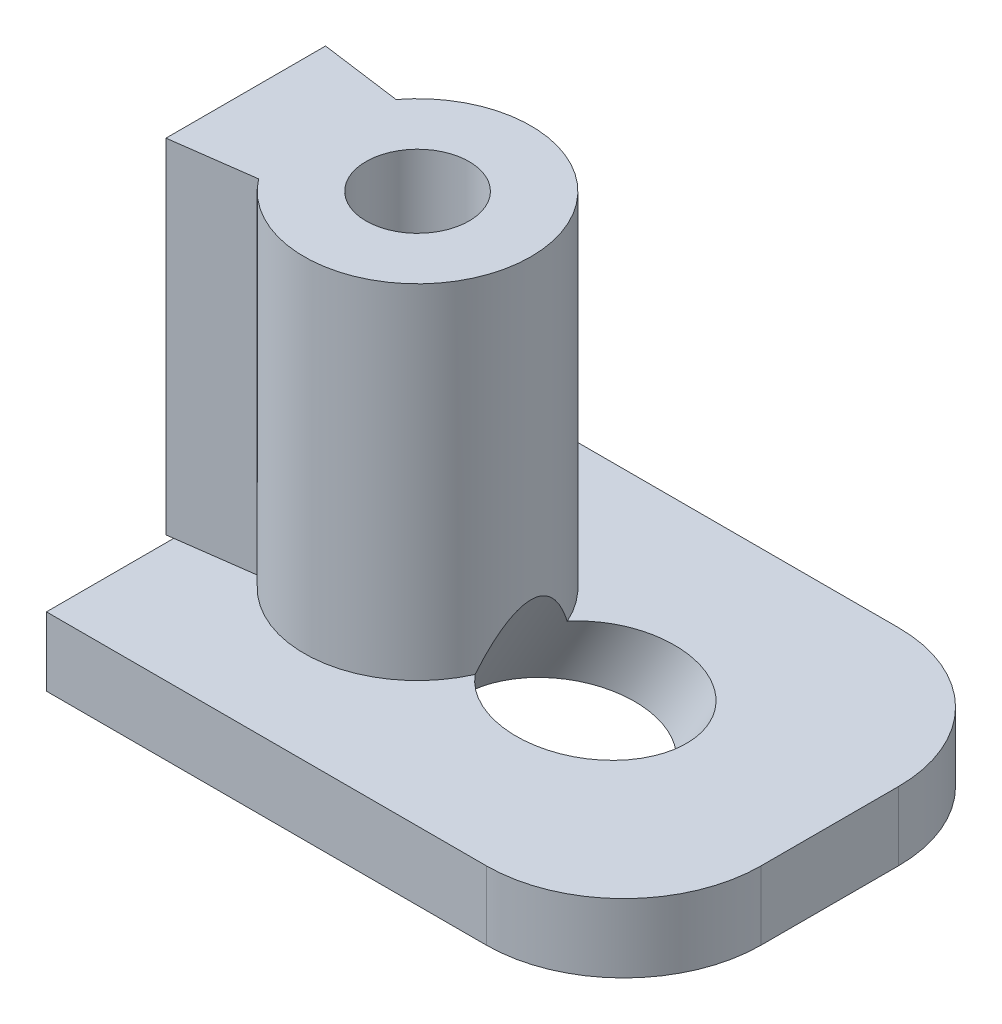
ISO-10303-21;
HEADER;
FILE_DESCRIPTION(('STEP AP214'),'2;1');
FILE_NAME('part.step','',(''),(''),'','','');
FILE_SCHEMA(('AUTOMOTIVE_DESIGN { 1 0 10303 214 1 1 1 1 }'));
ENDSEC;
DATA;
#1=APPLICATION_CONTEXT('core data for automotive mechanical design processes');
#2=APPLICATION_PROTOCOL_DEFINITION('international standard','automotive_design',2000,#1);
#3=PRODUCT_CONTEXT('',#1,'mechanical');
#4=PRODUCT('Part','Part','',(#3));
#5=PRODUCT_RELATED_PRODUCT_CATEGORY('part','',(#4));
#6=PRODUCT_DEFINITION_FORMATION('','',#4);
#7=PRODUCT_DEFINITION_CONTEXT('part definition',#1,'design');
#8=PRODUCT_DEFINITION('design','',#6,#7);
#9=PRODUCT_DEFINITION_SHAPE('','',#8);
#10=(LENGTH_UNIT() NAMED_UNIT(*) SI_UNIT(.MILLI.,.METRE.));
#11=(NAMED_UNIT(*) PLANE_ANGLE_UNIT() SI_UNIT($,.RADIAN.));
#12=(NAMED_UNIT(*) SI_UNIT($,.STERADIAN.) SOLID_ANGLE_UNIT());
#13=UNCERTAINTY_MEASURE_WITH_UNIT(LENGTH_MEASURE(1.E-05),#10,'distance_accuracy_value','');
#14=(GEOMETRIC_REPRESENTATION_CONTEXT(3) GLOBAL_UNCERTAINTY_ASSIGNED_CONTEXT((#13)) GLOBAL_UNIT_ASSIGNED_CONTEXT((#10,
#11,#12)) REPRESENTATION_CONTEXT('',''));
#15=CARTESIAN_POINT('',(0.,0.,0.));
#16=DIRECTION('',(0.,0.,1.));
#17=DIRECTION('',(1.,0.,0.));
#18=AXIS2_PLACEMENT_3D('',#15,#16,#17);
#19=CARTESIAN_POINT('',(2.5,7.75,0.));
#20=DIRECTION('',(0.,1.,0.));
#21=DIRECTION('',(0.,0.,1.));
#22=AXIS2_PLACEMENT_3D('',#19,#20,#21);
#23=PLANE('',#22);
#24=DIRECTION('',(0.,0.,-1.));
#25=VECTOR('',#24,1.);
#26=CARTESIAN_POINT('',(1.30000000001017,7.75,1.49999999996326));
#27=LINE('',#26,#25);
#28=CARTESIAN_POINT('',(1.30000000001017,7.75,0.573731658954848));
#29=VERTEX_POINT('',#28);
#30=CARTESIAN_POINT('',(1.30000000001017,7.75,-0.573731658954847));
#31=VERTEX_POINT('',#30);
#32=EDGE_CURVE('E48',#29,#31,#27,.T.);
#33=ORIENTED_EDGE('',*,*,#32,.F.);
#34=DIRECTION('',(0.990932376959291,0.,-0.134361543210135));
#35=VECTOR('',#34,1.);
#36=CARTESIAN_POINT('',(1.84377976257967,7.75,0.500000000000001));
#37=LINE('',#36,#35);
#38=CARTESIAN_POINT('',(1.25000000001017,7.75,0.580511210533455));
#39=VERTEX_POINT('',#38);
#40=EDGE_CURVE('E281',#39,#29,#37,.T.);
#41=ORIENTED_EDGE('',*,*,#40,.F.);
#42=DIRECTION('',(0.,0.,1.));
#43=VECTOR('',#42,1.);
#44=CARTESIAN_POINT('',(1.25000000001017,7.75,0.580511210533455));
#45=LINE('',#44,#43);
#46=CARTESIAN_POINT('',(1.25000000001017,7.75,-0.580511210533454));
#47=VERTEX_POINT('',#46);
#48=EDGE_CURVE('E136',#47,#39,#45,.T.);
#49=ORIENTED_EDGE('',*,*,#48,.F.);
#50=DIRECTION('',(-0.990932376959291,0.,-0.134361543210137));
#51=VECTOR('',#50,1.);
#52=CARTESIAN_POINT('',(1.25000000001017,7.75,-0.580511210533454));
#53=LINE('',#52,#51);
#54=EDGE_CURVE('E227',#31,#47,#53,.T.);
#55=ORIENTED_EDGE('',*,*,#54,.F.);
#56=EDGE_LOOP('',(#33,#41,#49,#55));
#57=FACE_BOUND('',#56,.T.);
#58=ADVANCED_FACE('F39',(#57),#23,.F.);
#59=CARTESIAN_POINT('',(2.5,9.25,0.));
#60=DIRECTION('',(0.,-1.,0.));
#61=DIRECTION('',(0.,0.,-1.));
#62=AXIS2_PLACEMENT_3D('',#59,#60,#61);
#63=CYLINDRICAL_SURFACE('',#62,0.824999999999999);
#64=CARTESIAN_POINT('',(2.5,7.75,0.));
#65=DIRECTION('',(0.,1.,0.));
#66=DIRECTION('',(0.,0.,1.));
#67=AXIS2_PLACEMENT_3D('',#64,#65,#66);
#68=CIRCLE('',#67,0.824999999999999);
#69=CARTESIAN_POINT('',(1.84377976257967,7.75,0.500000000000001));
#70=VERTEX_POINT('',#69);
#71=CARTESIAN_POINT('',(3.25386128245776,7.75,0.335139026093854));
#72=VERTEX_POINT('',#71);
#73=EDGE_CURVE('E233',#70,#72,#68,.T.);
#74=ORIENTED_EDGE('',*,*,#73,.T.);
#75=CARTESIAN_POINT('',(3.25386128245776,7.75,0.335139026093854));
#76=CARTESIAN_POINT('',(3.25811827945143,7.77111145134007,0.325541480594741));
#77=CARTESIAN_POINT('',(3.26237618985324,7.79203851414726,0.315490895272771));
#78=CARTESIAN_POINT('',(3.27087060163928,7.83346444112072,0.294143706094102));
#79=CARTESIAN_POINT('',(3.27510666885029,7.85395862240085,0.282837894462469));
#80=CARTESIAN_POINT('',(3.28365867745061,7.89504882720899,0.258226700738959));
#81=CARTESIAN_POINT('',(3.28796923505354,7.91560562627378,0.244852971195866));
#82=CARTESIAN_POINT('',(3.29633558540741,7.95525746882288,0.216100636082207));
#83=CARTESIAN_POINT('',(3.30039223893617,7.97435750521167,0.200729416591836));
#84=CARTESIAN_POINT('',(3.3068811786802,8.00475583811144,0.172365461038509));
#85=CARTESIAN_POINT('',(3.30943325103671,8.01666468819849,0.160062926805976));
#86=CARTESIAN_POINT('',(3.31415936947011,8.03865387144431,0.133955802069157));
#87=CARTESIAN_POINT('',(3.31633608493243,8.04874714052105,0.120163058618312));
#88=CARTESIAN_POINT('',(3.31949670108628,8.06337210909149,0.0956487923371603));
#89=CARTESIAN_POINT('',(3.32063801388451,8.06864369968799,0.0853948313894527));
#90=CARTESIAN_POINT('',(3.32257028030641,8.07755972822864,0.0641595159964622));
#91=CARTESIAN_POINT('',(3.32336147927492,8.0812053056277,0.0531786771391695));
#92=CARTESIAN_POINT('',(3.32451106354808,8.08649985099804,0.0305834067615675));
#93=CARTESIAN_POINT('',(3.32486475076176,8.08812714672857,0.0189634739441499));
#94=CARTESIAN_POINT('',(3.32507075738346,8.08907515740627,-0.00437514955612619));
#95=CARTESIAN_POINT('',(3.32492327601952,8.08839678891716,-0.0160937991488201));
#96=CARTESIAN_POINT('',(3.32420599420556,8.08509483171219,-0.0375262797973913));
#97=CARTESIAN_POINT('',(3.32369887705464,8.08275994627251,-0.0472892373627836));
#98=CARTESIAN_POINT('',(3.32238349803524,8.07669752546358,-0.0663453282431124));
#99=CARTESIAN_POINT('',(3.32157510025383,8.07296936156009,-0.0756382473634516));
#100=CARTESIAN_POINT('',(3.31915992515662,8.06181618546568,-0.0990567266198888));
#101=CARTESIAN_POINT('',(3.31736498722118,8.05351449699766,-0.112742182378179));
#102=CARTESIAN_POINT('',(3.3133685530943,8.03497759042128,-0.138670077205083));
#103=CARTESIAN_POINT('',(3.31116570433568,8.02473593703016,-0.15090748678667));
#104=CARTESIAN_POINT('',(3.30435312281886,7.9929546603496,-0.184834268167634));
#105=CARTESIAN_POINT('',(3.29939752035186,7.96970764985597,-0.204830208753251));
#106=CARTESIAN_POINT('',(3.28906892407751,7.92085898946442,-0.24157132260841));
#107=CARTESIAN_POINT('',(3.28369431237605,7.89524813437457,-0.258302923156063));
#108=CARTESIAN_POINT('',(3.27421193936738,7.84963382590647,-0.285248119484467));
#109=CARTESIAN_POINT('',(3.27014588007999,7.82994285917185,-0.296014031765552));
#110=CARTESIAN_POINT('',(3.26200673466994,7.79022219707945,-0.316365288634048));
#111=CARTESIAN_POINT('',(3.25793414959498,7.77019805751701,-0.325961622383703));
#112=CARTESIAN_POINT('',(3.25386128245776,7.75,-0.335139026093853));
#113=B_SPLINE_CURVE_WITH_KNOTS('',3,(#75,#76,#77,#78,#79,#80,#81,#82,#83,#84,#85,#86,#87,#88,
#89,#90,#91,#92,#93,#94,#95,#96,#97,#98,#99,#100,#101,#102,#103,#104,#105,#106,#107,#108,#109,
#110,#111,#112),.UNSPECIFIED.,.F.,.F.,(4,2,2,2,2,2,2,2,2,2,2,2,2,2,2,2,2,2,4),(0.,
0.0707590786088198,0.142076599835266,0.216696383892076,0.291047707088387,0.342874159646893,
0.394315307428964,0.428961111740479,0.46358259915488,0.498572719615471,0.533548932186501,
0.56357810303105,0.59362083698671,0.641661779813978,0.689864967823453,0.782531021828784,
0.875574521702554,0.943962360776457,1.01164783934957),.UNSPECIFIED.);
#114=CARTESIAN_POINT('',(3.25386128245776,7.75,-0.335139026093853));
#115=VERTEX_POINT('',#114);
#116=EDGE_CURVE('E53',#72,#115,#113,.T.);
#117=ORIENTED_EDGE('',*,*,#116,.T.);
#118=CARTESIAN_POINT('',(1.84377976257967,7.75,-0.499999999999999));
#119=VERTEX_POINT('',#118);
#120=EDGE_CURVE('E276',#115,#119,#68,.T.);
#121=ORIENTED_EDGE('',*,*,#120,.T.);
#122=DIRECTION('',(0.,-1.,0.));
#123=VECTOR('',#122,1.);
#124=CARTESIAN_POINT('',(1.84377976257967,9.25,-0.499999999999999));
#125=LINE('',#124,#123);
#126=CARTESIAN_POINT('',(1.84377976257967,10.25,-0.5));
#127=VERTEX_POINT('',#126);
#128=EDGE_CURVE('E228',#127,#119,#125,.T.);
#129=ORIENTED_EDGE('',*,*,#128,.F.);
#130=CARTESIAN_POINT('',(2.5,10.25,0.));
#131=DIRECTION('',(0.,1.,0.));
#132=DIRECTION('',(0.,0.,1.));
#133=AXIS2_PLACEMENT_3D('',#130,#131,#132);
#134=CIRCLE('',#133,0.824999999999999);
#135=CARTESIAN_POINT('',(1.84377976257967,10.25,0.500000000000001));
#136=VERTEX_POINT('',#135);
#137=EDGE_CURVE('E148',#136,#127,#134,.T.);
#138=ORIENTED_EDGE('',*,*,#137,.F.);
#139=DIRECTION('',(0.,-1.,0.));
#140=VECTOR('',#139,1.);
#141=CARTESIAN_POINT('',(1.84377976257967,9.25,0.500000000000001));
#142=LINE('',#141,#140);
#143=EDGE_CURVE('E139',#136,#70,#142,.T.);
#144=ORIENTED_EDGE('',*,*,#143,.T.);
#145=EDGE_LOOP('',(#74,#117,#121,#129,#138,#144));
#146=FACE_BOUND('',#145,.T.);
#147=ADVANCED_FACE('F41',(#146),#63,.T.);
#148=CARTESIAN_POINT('',(1.25000000001017,9.25,-0.580511210533454));
#149=DIRECTION('',(-0.134361543210137,0.,0.990932376959291));
#150=DIRECTION('',(0.990932376959291,0.,0.134361543210137));
#151=AXIS2_PLACEMENT_3D('',#148,#149,#150);
#152=PLANE('',#151);
#153=EDGE_CURVE('E226',#119,#31,#53,.T.);
#154=ORIENTED_EDGE('',*,*,#153,.T.);
#155=ORIENTED_EDGE('',*,*,#54,.T.);
#156=DIRECTION('',(0.,-1.,0.));
#157=VECTOR('',#156,1.);
#158=CARTESIAN_POINT('',(1.25000000001017,9.25,-0.580511210533454));
#159=LINE('',#158,#157);
#160=CARTESIAN_POINT('',(1.25000000001017,10.25,-0.580511210533454));
#161=VERTEX_POINT('',#160);
#162=EDGE_CURVE('E138',#161,#47,#159,.T.);
#163=ORIENTED_EDGE('',*,*,#162,.F.);
#164=DIRECTION('',(-0.990932376959291,0.,-0.134361543210137));
#165=VECTOR('',#164,1.);
#166=CARTESIAN_POINT('',(1.84377976257967,10.25,-0.499999999999999));
#167=LINE('',#166,#165);
#168=EDGE_CURVE('E154',#127,#161,#167,.T.);
#169=ORIENTED_EDGE('',*,*,#168,.F.);
#170=ORIENTED_EDGE('',*,*,#128,.T.);
#171=EDGE_LOOP('',(#154,#155,#163,#169,#170));
#172=FACE_BOUND('',#171,.T.);
#173=ADVANCED_FACE('F217',(#172),#152,.F.);
#174=CARTESIAN_POINT('',(1.25000000001017,9.25,0.580511210533455));
#175=DIRECTION('',(1.,0.,0.));
#176=DIRECTION('',(0.,0.,-1.));
#177=AXIS2_PLACEMENT_3D('',#174,#175,#176);
#178=PLANE('',#177);
#179=ORIENTED_EDGE('',*,*,#48,.T.);
#180=DIRECTION('',(0.,-1.,0.));
#181=VECTOR('',#180,1.);
#182=CARTESIAN_POINT('',(1.25000000001017,9.25,0.580511210533455));
#183=LINE('',#182,#181);
#184=CARTESIAN_POINT('',(1.25000000001017,10.25,0.580511210533455));
#185=VERTEX_POINT('',#184);
#186=EDGE_CURVE('E129',#185,#39,#183,.T.);
#187=ORIENTED_EDGE('',*,*,#186,.F.);
#188=DIRECTION('',(0.,0.,1.));
#189=VECTOR('',#188,1.);
#190=CARTESIAN_POINT('',(1.25000000001017,10.25,-0.580511210533454));
#191=LINE('',#190,#189);
#192=EDGE_CURVE('E134',#161,#185,#191,.T.);
#193=ORIENTED_EDGE('',*,*,#192,.F.);
#194=ORIENTED_EDGE('',*,*,#162,.T.);
#195=EDGE_LOOP('',(#179,#187,#193,#194));
#196=FACE_BOUND('',#195,.T.);
#197=ADVANCED_FACE('F131',(#196),#178,.F.);
#198=CARTESIAN_POINT('',(1.84377976257967,9.25,0.500000000000001));
#199=DIRECTION('',(-0.134361543210135,0.,-0.990932376959291));
#200=DIRECTION('',(-0.990932376959291,0.,0.134361543210135));
#201=AXIS2_PLACEMENT_3D('',#198,#199,#200);
#202=PLANE('',#201);
#203=ORIENTED_EDGE('',*,*,#40,.T.);
#204=EDGE_CURVE('E280',#29,#70,#37,.T.);
#205=ORIENTED_EDGE('',*,*,#204,.T.);
#206=ORIENTED_EDGE('',*,*,#143,.F.);
#207=DIRECTION('',(0.990932376959291,0.,-0.134361543210135));
#208=VECTOR('',#207,1.);
#209=CARTESIAN_POINT('',(1.25000000001017,10.25,0.580511210533455));
#210=LINE('',#209,#208);
#211=EDGE_CURVE('E142',#185,#136,#210,.T.);
#212=ORIENTED_EDGE('',*,*,#211,.F.);
#213=ORIENTED_EDGE('',*,*,#186,.T.);
#214=EDGE_LOOP('',(#203,#205,#206,#212,#213));
#215=FACE_BOUND('',#214,.T.);
#216=ADVANCED_FACE('F143',(#215),#202,.F.);
#217=CARTESIAN_POINT('',(4.50000000001019,7.25,0.499999999963261));
#218=DIRECTION('',(0.,1.,0.));
#219=DIRECTION('',(-1.,0.,0.));
#220=AXIS2_PLACEMENT_3D('',#217,#218,#219);
#221=PLANE('',#220);
#222=CARTESIAN_POINT('',(3.50470053838943,7.25,0.));
#223=DIRECTION('',(0.,1.,0.));
#224=DIRECTION('',(1.,0.,0.));
#225=AXIS2_PLACEMENT_3D('',#222,#223,#224);
#226=ELLIPSE('',#225,0.663952809568066,0.575);
#227=CARTESIAN_POINT('',(4.16865334795749,7.25,0.));
#228=VERTEX_POINT('',#227);
#229=EDGE_CURVE('E168',#228,#228,#226,.T.);
#230=ORIENTED_EDGE('',*,*,#229,.T.);
#231=EDGE_LOOP('',(#230));
#232=FACE_BOUND('',#231,.T.);
#233=DIRECTION('',(-1.,0.,0.));
#234=VECTOR('',#233,1.);
#235=CARTESIAN_POINT('',(1.30000000001017,7.25,1.49999999996326));
#236=LINE('',#235,#234);
#237=CARTESIAN_POINT('',(4.50000000001019,7.25,1.49999999996326));
#238=VERTEX_POINT('',#237);
#239=CARTESIAN_POINT('',(1.30000000001017,7.25,1.49999999996326));
#240=VERTEX_POINT('',#239);
#241=EDGE_CURVE('E256',#238,#240,#236,.T.);
#242=ORIENTED_EDGE('',*,*,#241,.T.);
#243=DIRECTION('',(0.,0.,-1.));
#244=VECTOR('',#243,1.);
#245=CARTESIAN_POINT('',(1.30000000001017,7.25,1.49999999996326));
#246=LINE('',#245,#244);
#247=CARTESIAN_POINT('',(1.30000000001017,7.25,-1.50000000003674));
#248=VERTEX_POINT('',#247);
#249=EDGE_CURVE('E300',#240,#248,#246,.T.);
#250=ORIENTED_EDGE('',*,*,#249,.T.);
#251=DIRECTION('',(1.,0.,0.));
#252=VECTOR('',#251,1.);
#253=CARTESIAN_POINT('',(4.50000000001019,7.25,-1.50000000003674));
#254=LINE('',#253,#252);
#255=CARTESIAN_POINT('',(4.50000000001019,7.25,-1.50000000003674));
#256=VERTEX_POINT('',#255);
#257=EDGE_CURVE('E298',#248,#256,#254,.T.);
#258=ORIENTED_EDGE('',*,*,#257,.T.);
#259=CARTESIAN_POINT('',(4.50000000001019,7.25,-0.500000000036739));
#260=DIRECTION('',(0.,-1.,0.));
#261=DIRECTION('',(-1.,0.,0.));
#262=AXIS2_PLACEMENT_3D('',#259,#260,#261);
#263=CIRCLE('',#262,1.);
#264=CARTESIAN_POINT('',(5.50000000001019,7.25,-0.500000000036739));
#265=VERTEX_POINT('',#264);
#266=EDGE_CURVE('E296',#256,#265,#263,.T.);
#267=ORIENTED_EDGE('',*,*,#266,.T.);
#268=DIRECTION('',(0.,0.,1.));
#269=VECTOR('',#268,1.);
#270=CARTESIAN_POINT('',(5.50000000001019,7.25,0.499999999963261));
#271=LINE('',#270,#269);
#272=CARTESIAN_POINT('',(5.50000000001019,7.25,0.499999999963261));
#273=VERTEX_POINT('',#272);
#274=EDGE_CURVE('E294',#265,#273,#271,.T.);
#275=ORIENTED_EDGE('',*,*,#274,.T.);
#276=CARTESIAN_POINT('',(4.50000000001019,7.25,0.499999999963261));
#277=DIRECTION('',(0.,-1.,0.));
#278=DIRECTION('',(-1.,0.,0.));
#279=AXIS2_PLACEMENT_3D('',#276,#277,#278);
#280=CIRCLE('',#279,1.);
#281=EDGE_CURVE('E261',#273,#238,#280,.T.);
#282=ORIENTED_EDGE('',*,*,#281,.T.);
#283=EDGE_LOOP('',(#242,#250,#258,#267,#275,#282));
#284=FACE_BOUND('',#283,.T.);
#285=ADVANCED_FACE('F176',(#232,#284),#221,.F.);
#286=CARTESIAN_POINT('',(4.50000000001019,7.25,0.499999999963261));
#287=DIRECTION('',(0.,1.,0.));
#288=DIRECTION('',(-1.,0.,0.));
#289=AXIS2_PLACEMENT_3D('',#286,#287,#288);
#290=CYLINDRICAL_SURFACE('',#289,1.);
#291=CARTESIAN_POINT('',(4.50000000001019,7.75,0.499999999963261));
#292=DIRECTION('',(0.,-1.,0.));
#293=DIRECTION('',(-1.,0.,0.));
#294=AXIS2_PLACEMENT_3D('',#291,#292,#293);
#295=CIRCLE('',#294,1.);
#296=CARTESIAN_POINT('',(5.50000000001019,7.75,0.499999999963261));
#297=VERTEX_POINT('',#296);
#298=CARTESIAN_POINT('',(4.50000000001019,7.75,1.49999999996326));
#299=VERTEX_POINT('',#298);
#300=EDGE_CURVE('E254',#297,#299,#295,.T.);
#301=ORIENTED_EDGE('',*,*,#300,.T.);
#302=DIRECTION('',(0.,1.,0.));
#303=VECTOR('',#302,1.);
#304=CARTESIAN_POINT('',(4.50000000001019,7.25,1.49999999996326));
#305=LINE('',#304,#303);
#306=EDGE_CURVE('E257',#238,#299,#305,.T.);
#307=ORIENTED_EDGE('',*,*,#306,.F.);
#308=ORIENTED_EDGE('',*,*,#281,.F.);
#309=DIRECTION('',(0.,1.,0.));
#310=VECTOR('',#309,1.);
#311=CARTESIAN_POINT('',(5.50000000001019,7.25,0.499999999963261));
#312=LINE('',#311,#310);
#313=EDGE_CURVE('E260',#273,#297,#312,.T.);
#314=ORIENTED_EDGE('',*,*,#313,.T.);
#315=EDGE_LOOP('',(#301,#307,#308,#314));
#316=FACE_BOUND('',#315,.T.);
#317=ADVANCED_FACE('F179',(#316),#290,.T.);
#318=CARTESIAN_POINT('',(5.50000000001019,7.25,0.499999999963261));
#319=DIRECTION('',(-1.,0.,0.));
#320=DIRECTION('',(0.,-1.,0.));
#321=AXIS2_PLACEMENT_3D('',#318,#319,#320);
#322=PLANE('',#321);
#323=DIRECTION('',(0.,0.,1.));
#324=VECTOR('',#323,1.);
#325=CARTESIAN_POINT('',(5.50000000001019,7.75,0.499999999963261));
#326=LINE('',#325,#324);
#327=CARTESIAN_POINT('',(5.50000000001019,7.75,-0.500000000036739));
#328=VERTEX_POINT('',#327);
#329=EDGE_CURVE('E250',#328,#297,#326,.T.);
#330=ORIENTED_EDGE('',*,*,#329,.T.);
#331=ORIENTED_EDGE('',*,*,#313,.F.);
#332=ORIENTED_EDGE('',*,*,#274,.F.);
#333=DIRECTION('',(0.,1.,0.));
#334=VECTOR('',#333,1.);
#335=CARTESIAN_POINT('',(5.50000000001019,7.25,-0.500000000036739));
#336=LINE('',#335,#334);
#337=EDGE_CURVE('E264',#265,#328,#336,.T.);
#338=ORIENTED_EDGE('',*,*,#337,.T.);
#339=EDGE_LOOP('',(#330,#331,#332,#338));
#340=FACE_BOUND('',#339,.T.);
#341=ADVANCED_FACE('F188',(#340),#322,.F.);
#342=CARTESIAN_POINT('',(4.50000000001019,7.25,-0.500000000036739));
#343=DIRECTION('',(0.,1.,0.));
#344=DIRECTION('',(-1.,0.,0.));
#345=AXIS2_PLACEMENT_3D('',#342,#343,#344);
#346=CYLINDRICAL_SURFACE('',#345,1.);
#347=CARTESIAN_POINT('',(4.50000000001019,7.75,-0.500000000036739));
#348=DIRECTION('',(0.,-1.,0.));
#349=DIRECTION('',(-1.,0.,0.));
#350=AXIS2_PLACEMENT_3D('',#347,#348,#349);
#351=CIRCLE('',#350,1.);
#352=CARTESIAN_POINT('',(4.50000000001019,7.75,-1.50000000003674));
#353=VERTEX_POINT('',#352);
#354=EDGE_CURVE('E247',#353,#328,#351,.T.);
#355=ORIENTED_EDGE('',*,*,#354,.T.);
#356=ORIENTED_EDGE('',*,*,#337,.F.);
#357=ORIENTED_EDGE('',*,*,#266,.F.);
#358=DIRECTION('',(0.,1.,0.));
#359=VECTOR('',#358,1.);
#360=CARTESIAN_POINT('',(4.50000000001019,7.25,-1.50000000003674));
#361=LINE('',#360,#359);
#362=EDGE_CURVE('E267',#256,#353,#361,.T.);
#363=ORIENTED_EDGE('',*,*,#362,.T.);
#364=EDGE_LOOP('',(#355,#356,#357,#363));
#365=FACE_BOUND('',#364,.T.);
#366=ADVANCED_FACE('F192',(#365),#346,.T.);
#367=CARTESIAN_POINT('',(4.50000000001019,7.25,-1.50000000003674));
#368=DIRECTION('',(0.,0.,1.));
#369=DIRECTION('',(1.,0.,0.));
#370=AXIS2_PLACEMENT_3D('',#367,#368,#369);
#371=PLANE('',#370);
#372=DIRECTION('',(1.,0.,0.));
#373=VECTOR('',#372,1.);
#374=CARTESIAN_POINT('',(4.50000000001019,7.75,-1.50000000003674));
#375=LINE('',#374,#373);
#376=CARTESIAN_POINT('',(1.30000000001017,7.75,-1.50000000003674));
#377=VERTEX_POINT('',#376);
#378=EDGE_CURVE('E237',#377,#353,#375,.T.);
#379=ORIENTED_EDGE('',*,*,#378,.T.);
#380=ORIENTED_EDGE('',*,*,#362,.F.);
#381=ORIENTED_EDGE('',*,*,#257,.F.);
#382=DIRECTION('',(0.,1.,0.));
#383=VECTOR('',#382,1.);
#384=CARTESIAN_POINT('',(1.30000000001017,7.25,-1.50000000003674));
#385=LINE('',#384,#383);
#386=EDGE_CURVE('E269',#248,#377,#385,.T.);
#387=ORIENTED_EDGE('',*,*,#386,.T.);
#388=EDGE_LOOP('',(#379,#380,#381,#387));
#389=FACE_BOUND('',#388,.T.);
#390=ADVANCED_FACE('F196',(#389),#371,.F.);
#391=CARTESIAN_POINT('',(1.30000000001017,7.25,1.49999999996326));
#392=DIRECTION('',(1.,0.,0.));
#393=DIRECTION('',(0.,0.,-1.));
#394=AXIS2_PLACEMENT_3D('',#391,#392,#393);
#395=PLANE('',#394);
#396=CARTESIAN_POINT('',(1.30000000001017,7.75,1.49999999996326));
#397=VERTEX_POINT('',#396);
#398=EDGE_CURVE('E240',#397,#29,#27,.T.);
#399=ORIENTED_EDGE('',*,*,#398,.T.);
#400=ORIENTED_EDGE('',*,*,#32,.T.);
#401=EDGE_CURVE('E235',#31,#377,#27,.T.);
#402=ORIENTED_EDGE('',*,*,#401,.T.);
#403=ORIENTED_EDGE('',*,*,#386,.F.);
#404=ORIENTED_EDGE('',*,*,#249,.F.);
#405=DIRECTION('',(0.,1.,0.));
#406=VECTOR('',#405,1.);
#407=CARTESIAN_POINT('',(1.30000000001017,7.25,1.49999999996326));
#408=LINE('',#407,#406);
#409=EDGE_CURVE('E271',#240,#397,#408,.T.);
#410=ORIENTED_EDGE('',*,*,#409,.T.);
#411=EDGE_LOOP('',(#399,#400,#402,#403,#404,#410));
#412=FACE_BOUND('',#411,.T.);
#413=ADVANCED_FACE('F200',(#412),#395,.F.);
#414=CARTESIAN_POINT('',(1.30000000001017,7.25,1.49999999996326));
#415=DIRECTION('',(0.,0.,-1.));
#416=DIRECTION('',(0.,1.,0.));
#417=AXIS2_PLACEMENT_3D('',#414,#415,#416);
#418=PLANE('',#417);
#419=DIRECTION('',(-1.,0.,0.));
#420=VECTOR('',#419,1.);
#421=CARTESIAN_POINT('',(1.30000000001017,7.75,1.49999999996326));
#422=LINE('',#421,#420);
#423=EDGE_CURVE('E241',#299,#397,#422,.T.);
#424=ORIENTED_EDGE('',*,*,#423,.T.);
#425=ORIENTED_EDGE('',*,*,#409,.F.);
#426=ORIENTED_EDGE('',*,*,#241,.F.);
#427=ORIENTED_EDGE('',*,*,#306,.T.);
#428=EDGE_LOOP('',(#424,#425,#426,#427));
#429=FACE_BOUND('',#428,.T.);
#430=ADVANCED_FACE('F204',(#429),#418,.F.);
#431=CARTESIAN_POINT('',(4.50000000001019,7.75,0.499999999963261));
#432=DIRECTION('',(0.,1.,0.));
#433=DIRECTION('',(-1.,0.,0.));
#434=AXIS2_PLACEMENT_3D('',#431,#432,#433);
#435=PLANE('',#434);
#436=CARTESIAN_POINT('',(3.79337567298423,7.75,0.));
#437=DIRECTION('',(0.,1.,0.));
#438=DIRECTION('',(1.,0.,0.));
#439=AXIS2_PLACEMENT_3D('',#436,#437,#438);
#440=ELLIPSE('',#439,0.663952809568066,0.575);
#441=EDGE_CURVE('E11',#72,#115,#440,.T.);
#442=ORIENTED_EDGE('',*,*,#441,.F.);
#443=ORIENTED_EDGE('',*,*,#73,.F.);
#444=ORIENTED_EDGE('',*,*,#204,.F.);
#445=ORIENTED_EDGE('',*,*,#398,.F.);
#446=ORIENTED_EDGE('',*,*,#423,.F.);
#447=ORIENTED_EDGE('',*,*,#300,.F.);
#448=ORIENTED_EDGE('',*,*,#329,.F.);
#449=ORIENTED_EDGE('',*,*,#354,.F.);
#450=ORIENTED_EDGE('',*,*,#378,.F.);
#451=ORIENTED_EDGE('',*,*,#401,.F.);
#452=ORIENTED_EDGE('',*,*,#153,.F.);
#453=ORIENTED_EDGE('',*,*,#120,.F.);
#454=EDGE_LOOP('',(#442,#443,#444,#445,#446,#447,#448,#449,#450,#451,#452,#453));
#455=FACE_BOUND('',#454,.T.);
#456=ADVANCED_FACE('F175',(#455),#435,.T.);
#457=CARTESIAN_POINT('',(2.0750000000102,4.77368602791855,0.));
#458=DIRECTION('',(0.499999999999993,0.866025403784443,0.));
#459=DIRECTION('',(-0.866025403784443,0.499999999999993,0.));
#460=AXIS2_PLACEMENT_3D('',#457,#458,#459);
#461=CYLINDRICAL_SURFACE('',#460,0.575);
#462=ORIENTED_EDGE('',*,*,#441,.T.);
#463=ORIENTED_EDGE('',*,*,#116,.F.);
#464=EDGE_LOOP('',(#462,#463));
#465=FACE_BOUND('',#464,.T.);
#466=ORIENTED_EDGE('',*,*,#229,.F.);
#467=EDGE_LOOP('',(#466));
#468=FACE_BOUND('',#467,.T.);
#469=ADVANCED_FACE('F170',(#465,#468),#461,.F.);
#470=CARTESIAN_POINT('',(2.5,10.25,0.));
#471=DIRECTION('',(0.,1.,0.));
#472=DIRECTION('',(0.,0.,1.));
#473=AXIS2_PLACEMENT_3D('',#470,#471,#472);
#474=PLANE('',#473);
#475=ORIENTED_EDGE('',*,*,#192,.T.);
#476=ORIENTED_EDGE('',*,*,#211,.T.);
#477=ORIENTED_EDGE('',*,*,#137,.T.);
#478=ORIENTED_EDGE('',*,*,#168,.T.);
#479=EDGE_LOOP('',(#475,#476,#477,#478));
#480=FACE_BOUND('',#479,.T.);
#481=CARTESIAN_POINT('',(2.5,10.25,0.));
#482=DIRECTION('',(0.,1.,0.));
#483=DIRECTION('',(0.,0.,1.));
#484=AXIS2_PLACEMENT_3D('',#481,#482,#483);
#485=CIRCLE('',#484,0.374999999999997);
#486=CARTESIAN_POINT('',(2.5,10.25,0.374999999999997));
#487=VERTEX_POINT('',#486);
#488=EDGE_CURVE('E155',#487,#487,#485,.T.);
#489=ORIENTED_EDGE('',*,*,#488,.F.);
#490=EDGE_LOOP('',(#489));
#491=FACE_BOUND('',#490,.T.);
#492=ADVANCED_FACE('F151',(#480,#491),#474,.T.);
#493=CARTESIAN_POINT('',(2.5,7.75,0.));
#494=DIRECTION('',(0.,1.,0.));
#495=DIRECTION('',(0.,0.,1.));
#496=AXIS2_PLACEMENT_3D('',#493,#494,#495);
#497=CIRCLE('',#496,0.374999999999997);
#498=CARTESIAN_POINT('',(2.5,7.75,0.374999999999998));
#499=VERTEX_POINT('',#498);
#500=EDGE_CURVE('E273',#499,#499,#497,.T.);
#501=ORIENTED_EDGE('',*,*,#500,.T.);
#502=EDGE_LOOP('',(#501));
#503=FACE_BOUND('',#502,.T.);
#504=ADVANCED_FACE('F181',(#503),#435,.T.);
#505=CARTESIAN_POINT('',(2.5,9.25,0.));
#506=DIRECTION('',(0.,-1.,0.));
#507=DIRECTION('',(0.,0.,-1.));
#508=AXIS2_PLACEMENT_3D('',#505,#506,#507);
#509=CYLINDRICAL_SURFACE('',#508,0.374999999999997);
#510=ORIENTED_EDGE('',*,*,#500,.F.);
#511=EDGE_LOOP('',(#510));
#512=FACE_BOUND('',#511,.T.);
#513=ORIENTED_EDGE('',*,*,#488,.T.);
#514=EDGE_LOOP('',(#513));
#515=FACE_BOUND('',#514,.T.);
#516=ADVANCED_FACE('F184',(#512,#515),#509,.F.);
#517=CLOSED_SHELL('',(#58,#147,#173,#197,#216,#285,#317,#341,#366,#390,#413,#430,#456,#469,#492,
#504,#516));
#518=MANIFOLD_SOLID_BREP('B2',#517);
#519=ADVANCED_BREP_SHAPE_REPRESENTATION('',(#18,#518),#14);
#520=SHAPE_DEFINITION_REPRESENTATION(#9,#519);
ENDSEC;
END-ISO-10303-21;
